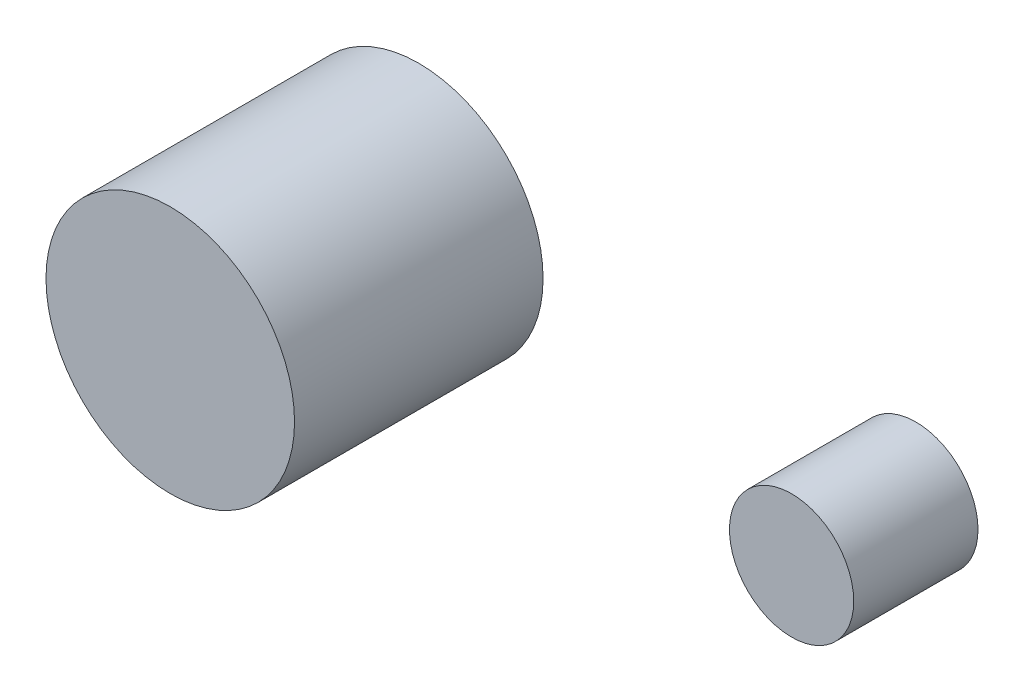
ISO-10303-21;
HEADER;
FILE_DESCRIPTION(('STEP AP214'),'2;1');
FILE_NAME('part.step','',(''),(''),'','','');
FILE_SCHEMA(('AUTOMOTIVE_DESIGN { 1 0 10303 214 1 1 1 1 }'));
ENDSEC;
DATA;
#1=APPLICATION_CONTEXT('core data for automotive mechanical design processes');
#2=APPLICATION_PROTOCOL_DEFINITION('international standard','automotive_design',2000,#1);
#3=PRODUCT_CONTEXT('',#1,'mechanical');
#4=PRODUCT('Part','Part','',(#3));
#5=PRODUCT_RELATED_PRODUCT_CATEGORY('part','',(#4));
#6=PRODUCT_DEFINITION_FORMATION('','',#4);
#7=PRODUCT_DEFINITION_CONTEXT('part definition',#1,'design');
#8=PRODUCT_DEFINITION('design','',#6,#7);
#9=PRODUCT_DEFINITION_SHAPE('','',#8);
#10=(LENGTH_UNIT() NAMED_UNIT(*) SI_UNIT(.MILLI.,.METRE.));
#11=(NAMED_UNIT(*) PLANE_ANGLE_UNIT() SI_UNIT($,.RADIAN.));
#12=(NAMED_UNIT(*) SI_UNIT($,.STERADIAN.) SOLID_ANGLE_UNIT());
#13=UNCERTAINTY_MEASURE_WITH_UNIT(LENGTH_MEASURE(1.E-05),#10,'distance_accuracy_value','');
#14=(GEOMETRIC_REPRESENTATION_CONTEXT(3) GLOBAL_UNCERTAINTY_ASSIGNED_CONTEXT((#13)) GLOBAL_UNIT_ASSIGNED_CONTEXT((#10,
#11,#12)) REPRESENTATION_CONTEXT('',''));
#15=CARTESIAN_POINT('',(0.,0.,0.));
#16=DIRECTION('',(0.,0.,1.));
#17=DIRECTION('',(1.,0.,0.));
#18=AXIS2_PLACEMENT_3D('',#15,#16,#17);
#19=CARTESIAN_POINT('',(40.,0.,10.));
#20=DIRECTION('',(0.,0.,-1.));
#21=DIRECTION('',(-1.,0.,0.));
#22=AXIS2_PLACEMENT_3D('',#19,#20,#21);
#23=CYLINDRICAL_SURFACE('',#22,5.);
#24=CARTESIAN_POINT('',(40.,0.,10.));
#25=DIRECTION('',(0.,0.,1.));
#26=DIRECTION('',(1.,0.,0.));
#27=AXIS2_PLACEMENT_3D('',#24,#25,#26);
#28=CIRCLE('',#27,5.);
#29=CARTESIAN_POINT('',(45.,0.,10.));
#30=VERTEX_POINT('',#29);
#31=EDGE_CURVE('E11',#30,#30,#28,.T.);
#32=ORIENTED_EDGE('',*,*,#31,.F.);
#33=EDGE_LOOP('',(#32));
#34=FACE_BOUND('',#33,.T.);
#35=CARTESIAN_POINT('',(40.,0.,0.));
#36=DIRECTION('',(0.,0.,1.));
#37=DIRECTION('',(1.,0.,0.));
#38=AXIS2_PLACEMENT_3D('',#35,#36,#37);
#39=CIRCLE('',#38,5.);
#40=CARTESIAN_POINT('',(45.,0.,0.));
#41=VERTEX_POINT('',#40);
#42=EDGE_CURVE('E52',#41,#41,#39,.T.);
#43=ORIENTED_EDGE('',*,*,#42,.T.);
#44=EDGE_LOOP('',(#43));
#45=FACE_BOUND('',#44,.T.);
#46=ADVANCED_FACE('F49',(#34,#45),#23,.T.);
#47=CARTESIAN_POINT('',(40.,0.,10.));
#48=DIRECTION('',(0.,0.,1.));
#49=DIRECTION('',(1.,0.,0.));
#50=AXIS2_PLACEMENT_3D('',#47,#48,#49);
#51=PLANE('',#50);
#52=ORIENTED_EDGE('',*,*,#31,.T.);
#53=EDGE_LOOP('',(#52));
#54=FACE_BOUND('',#53,.T.);
#55=ADVANCED_FACE('F64',(#54),#51,.T.);
#56=CARTESIAN_POINT('',(40.,0.,0.));
#57=DIRECTION('',(0.,0.,1.));
#58=DIRECTION('',(1.,0.,0.));
#59=AXIS2_PLACEMENT_3D('',#56,#57,#58);
#60=PLANE('',#59);
#61=ORIENTED_EDGE('',*,*,#42,.F.);
#62=EDGE_LOOP('',(#61));
#63=FACE_BOUND('',#62,.T.);
#64=ADVANCED_FACE('F62',(#63),#60,.F.);
#65=CLOSED_SHELL('',(#46,#55,#64));
#66=MANIFOLD_SOLID_BREP('B2',#65);
#67=CARTESIAN_POINT('',(0.,0.,20.));
#68=DIRECTION('',(0.,0.,-1.));
#69=DIRECTION('',(-1.,0.,0.));
#70=AXIS2_PLACEMENT_3D('',#67,#68,#69);
#71=CYLINDRICAL_SURFACE('',#70,10.);
#72=CARTESIAN_POINT('',(0.,0.,20.));
#73=DIRECTION('',(0.,0.,1.));
#74=DIRECTION('',(1.,0.,0.));
#75=AXIS2_PLACEMENT_3D('',#72,#73,#74);
#76=CIRCLE('',#75,10.);
#77=CARTESIAN_POINT('',(10.,0.,20.));
#78=VERTEX_POINT('',#77);
#79=EDGE_CURVE('E48',#78,#78,#76,.T.);
#80=ORIENTED_EDGE('',*,*,#79,.F.);
#81=EDGE_LOOP('',(#80));
#82=FACE_BOUND('',#81,.T.);
#83=CARTESIAN_POINT('',(0.,0.,0.));
#84=DIRECTION('',(0.,0.,1.));
#85=DIRECTION('',(1.,0.,0.));
#86=AXIS2_PLACEMENT_3D('',#83,#84,#85);
#87=CIRCLE('',#86,10.);
#88=CARTESIAN_POINT('',(10.,0.,0.));
#89=VERTEX_POINT('',#88);
#90=EDGE_CURVE('E93',#89,#89,#87,.T.);
#91=ORIENTED_EDGE('',*,*,#90,.T.);
#92=EDGE_LOOP('',(#91));
#93=FACE_BOUND('',#92,.T.);
#94=ADVANCED_FACE('F90',(#82,#93),#71,.T.);
#95=CARTESIAN_POINT('',(0.,0.,20.));
#96=DIRECTION('',(0.,0.,1.));
#97=DIRECTION('',(1.,0.,0.));
#98=AXIS2_PLACEMENT_3D('',#95,#96,#97);
#99=PLANE('',#98);
#100=ORIENTED_EDGE('',*,*,#79,.T.);
#101=EDGE_LOOP('',(#100));
#102=FACE_BOUND('',#101,.T.);
#103=ADVANCED_FACE('F105',(#102),#99,.T.);
#104=CARTESIAN_POINT('',(0.,0.,0.));
#105=DIRECTION('',(0.,0.,1.));
#106=DIRECTION('',(1.,0.,0.));
#107=AXIS2_PLACEMENT_3D('',#104,#105,#106);
#108=PLANE('',#107);
#109=ORIENTED_EDGE('',*,*,#90,.F.);
#110=EDGE_LOOP('',(#109));
#111=FACE_BOUND('',#110,.T.);
#112=ADVANCED_FACE('F103',(#111),#108,.F.);
#113=CLOSED_SHELL('',(#94,#103,#112));
#114=MANIFOLD_SOLID_BREP('B6',#113);
#115=ADVANCED_BREP_SHAPE_REPRESENTATION('',(#18,#66,#114),#14);
#116=SHAPE_DEFINITION_REPRESENTATION(#9,#115);
ENDSEC;
END-ISO-10303-21;
